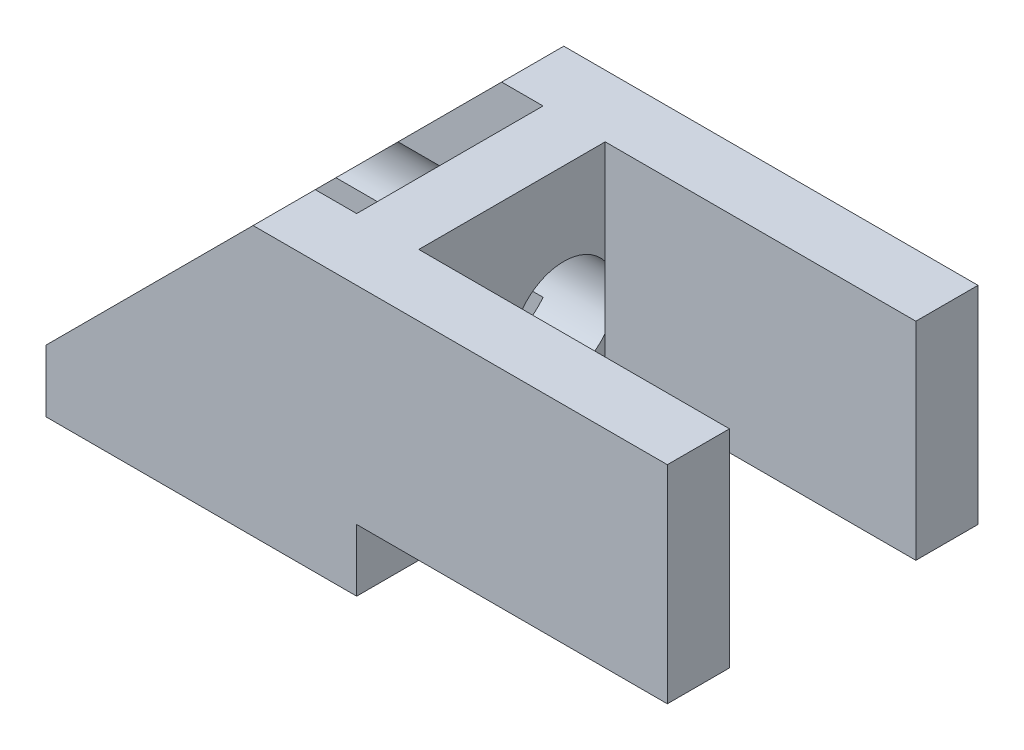
ISO-10303-21;
HEADER;
FILE_DESCRIPTION(('STEP AP214'),'2;1');
FILE_NAME('part.step','',(''),(''),'','','');
FILE_SCHEMA(('AUTOMOTIVE_DESIGN { 1 0 10303 214 1 1 1 1 }'));
ENDSEC;
DATA;
#1=APPLICATION_CONTEXT('core data for automotive mechanical design processes');
#2=APPLICATION_PROTOCOL_DEFINITION('international standard','automotive_design',2000,#1);
#3=PRODUCT_CONTEXT('',#1,'mechanical');
#4=PRODUCT('Part','Part','',(#3));
#5=PRODUCT_RELATED_PRODUCT_CATEGORY('part','',(#4));
#6=PRODUCT_DEFINITION_FORMATION('','',#4);
#7=PRODUCT_DEFINITION_CONTEXT('part definition',#1,'design');
#8=PRODUCT_DEFINITION('design','',#6,#7);
#9=PRODUCT_DEFINITION_SHAPE('','',#8);
#10=(LENGTH_UNIT() NAMED_UNIT(*) SI_UNIT(.MILLI.,.METRE.));
#11=(NAMED_UNIT(*) PLANE_ANGLE_UNIT() SI_UNIT($,.RADIAN.));
#12=(NAMED_UNIT(*) SI_UNIT($,.STERADIAN.) SOLID_ANGLE_UNIT());
#13=UNCERTAINTY_MEASURE_WITH_UNIT(LENGTH_MEASURE(1.E-05),#10,'distance_accuracy_value','');
#14=(GEOMETRIC_REPRESENTATION_CONTEXT(3) GLOBAL_UNCERTAINTY_ASSIGNED_CONTEXT((#13)) GLOBAL_UNIT_ASSIGNED_CONTEXT((#10,
#11,#12)) REPRESENTATION_CONTEXT('',''));
#15=CARTESIAN_POINT('',(0.,0.,0.));
#16=DIRECTION('',(0.,0.,1.));
#17=DIRECTION('',(1.,0.,0.));
#18=AXIS2_PLACEMENT_3D('',#15,#16,#17);
#19=CARTESIAN_POINT('',(0.,0.,-12.));
#20=DIRECTION('',(0.,0.,-1.));
#21=DIRECTION('',(1.,0.,0.));
#22=AXIS2_PLACEMENT_3D('',#19,#20,#21);
#23=PLANE('',#22);
#24=DIRECTION('',(-0.707106781186547,-0.707106781186548,0.));
#25=VECTOR('',#24,1.);
#26=CARTESIAN_POINT('',(0.,3.,-12.));
#27=LINE('',#26,#25);
#28=CARTESIAN_POINT('',(10.,13.,-12.));
#29=VERTEX_POINT('',#28);
#30=CARTESIAN_POINT('',(5.,8.,-12.));
#31=VERTEX_POINT('',#30);
#32=EDGE_CURVE('E170',#29,#31,#27,.T.);
#33=ORIENTED_EDGE('',*,*,#32,.T.);
#34=DIRECTION('',(1.,0.,0.));
#35=VECTOR('',#34,1.);
#36=CARTESIAN_POINT('',(-0.000999999999999265,8.,-12.));
#37=LINE('',#36,#35);
#38=CARTESIAN_POINT('',(12.,8.,-12.));
#39=VERTEX_POINT('',#38);
#40=EDGE_CURVE('E159',#39,#31,#37,.F.);
#41=ORIENTED_EDGE('',*,*,#40,.F.);
#42=DIRECTION('',(0.,1.,0.));
#43=VECTOR('',#42,1.);
#44=CARTESIAN_POINT('',(12.,13.,-12.));
#45=LINE('',#44,#43);
#46=CARTESIAN_POINT('',(12.,13.,-12.));
#47=VERTEX_POINT('',#46);
#48=EDGE_CURVE('E167',#39,#47,#45,.T.);
#49=ORIENTED_EDGE('',*,*,#48,.T.);
#50=DIRECTION('',(-1.,0.,0.));
#51=VECTOR('',#50,1.);
#52=CARTESIAN_POINT('',(10.,13.,-12.));
#53=LINE('',#52,#51);
#54=EDGE_CURVE('E202',#47,#29,#53,.T.);
#55=ORIENTED_EDGE('',*,*,#54,.T.);
#56=EDGE_LOOP('',(#33,#41,#49,#55));
#57=FACE_BOUND('',#56,.T.);
#58=ADVANCED_FACE('F33',(#57),#23,.F.);
#59=CARTESIAN_POINT('',(0.,3.,0.));
#60=DIRECTION('',(0.,-1.,0.));
#61=DIRECTION('',(0.,0.,-1.));
#62=AXIS2_PLACEMENT_3D('',#59,#60,#61);
#63=PLANE('',#62);
#64=DIRECTION('',(0.,0.,-1.));
#65=VECTOR('',#64,1.);
#66=CARTESIAN_POINT('',(12.,3.,-3.));
#67=LINE('',#66,#65);
#68=CARTESIAN_POINT('',(12.,3.,-3.));
#69=VERTEX_POINT('',#68);
#70=CARTESIAN_POINT('',(12.,3.,-12.));
#71=VERTEX_POINT('',#70);
#72=EDGE_CURVE('E178',#69,#71,#67,.T.);
#73=ORIENTED_EDGE('',*,*,#72,.T.);
#74=DIRECTION('',(1.,0.,0.));
#75=VECTOR('',#74,1.);
#76=CARTESIAN_POINT('',(30.,3.,-12.));
#77=LINE('',#76,#75);
#78=CARTESIAN_POINT('',(0.,3.,-12.));
#79=VERTEX_POINT('',#78);
#80=EDGE_CURVE('E196',#79,#71,#77,.T.);
#81=ORIENTED_EDGE('',*,*,#80,.F.);
#82=DIRECTION('',(0.,0.,1.));
#83=VECTOR('',#82,1.);
#84=CARTESIAN_POINT('',(0.,3.,0.));
#85=LINE('',#84,#83);
#86=CARTESIAN_POINT('',(0.,3.,-3.));
#87=VERTEX_POINT('',#86);
#88=EDGE_CURVE('E264',#79,#87,#85,.T.);
#89=ORIENTED_EDGE('',*,*,#88,.T.);
#90=DIRECTION('',(1.,0.,0.));
#91=VECTOR('',#90,1.);
#92=CARTESIAN_POINT('',(30.,3.,-3.));
#93=LINE('',#92,#91);
#94=EDGE_CURVE('E226',#87,#69,#93,.T.);
#95=ORIENTED_EDGE('',*,*,#94,.T.);
#96=EDGE_LOOP('',(#73,#81,#89,#95));
#97=FACE_BOUND('',#96,.T.);
#98=ADVANCED_FACE('F351',(#97),#63,.F.);
#99=CARTESIAN_POINT('',(0.,0.,-3.));
#100=DIRECTION('',(0.,0.,1.));
#101=DIRECTION('',(1.,0.,0.));
#102=AXIS2_PLACEMENT_3D('',#99,#100,#101);
#103=PLANE('',#102);
#104=DIRECTION('',(0.,-1.,0.));
#105=VECTOR('',#104,1.);
#106=CARTESIAN_POINT('',(12.,13.,-3.));
#107=LINE('',#106,#105);
#108=CARTESIAN_POINT('',(12.,13.,-3.));
#109=VERTEX_POINT('',#108);
#110=EDGE_CURVE('E181',#109,#69,#107,.T.);
#111=ORIENTED_EDGE('',*,*,#110,.T.);
#112=ORIENTED_EDGE('',*,*,#94,.F.);
#113=DIRECTION('',(-0.707106781186547,-0.707106781186548,0.));
#114=VECTOR('',#113,1.);
#115=CARTESIAN_POINT('',(0.,3.,-3.));
#116=LINE('',#115,#114);
#117=CARTESIAN_POINT('',(10.,13.,-3.));
#118=VERTEX_POINT('',#117);
#119=EDGE_CURVE('E237',#118,#87,#116,.T.);
#120=ORIENTED_EDGE('',*,*,#119,.F.);
#121=DIRECTION('',(-1.,0.,0.));
#122=VECTOR('',#121,1.);
#123=CARTESIAN_POINT('',(10.,13.,-3.));
#124=LINE('',#123,#122);
#125=EDGE_CURVE('E233',#109,#118,#124,.T.);
#126=ORIENTED_EDGE('',*,*,#125,.F.);
#127=EDGE_LOOP('',(#111,#112,#120,#126));
#128=FACE_BOUND('',#127,.T.);
#129=ADVANCED_FACE('F349',(#128),#103,.F.);
#130=CARTESIAN_POINT('',(12.,5.,-12.));
#131=VERTEX_POINT('',#130);
#132=EDGE_CURVE('E177',#71,#131,#45,.T.);
#133=ORIENTED_EDGE('',*,*,#132,.T.);
#134=DIRECTION('',(1.,0.,0.));
#135=VECTOR('',#134,1.);
#136=CARTESIAN_POINT('',(-0.000999999999999265,5.,-12.));
#137=LINE('',#136,#135);
#138=CARTESIAN_POINT('',(2.,5.,-12.));
#139=VERTEX_POINT('',#138);
#140=EDGE_CURVE('E55',#139,#131,#137,.T.);
#141=ORIENTED_EDGE('',*,*,#140,.F.);
#142=EDGE_CURVE('E199',#139,#79,#27,.T.);
#143=ORIENTED_EDGE('',*,*,#142,.T.);
#144=ORIENTED_EDGE('',*,*,#80,.T.);
#145=EDGE_LOOP('',(#133,#141,#143,#144));
#146=FACE_BOUND('',#145,.T.);
#147=ADVANCED_FACE('F354',(#146),#23,.F.);
#148=CARTESIAN_POINT('',(0.,3.,0.));
#149=DIRECTION('',(1.,0.,0.));
#150=DIRECTION('',(0.,0.,-1.));
#151=AXIS2_PLACEMENT_3D('',#148,#149,#150);
#152=PLANE('',#151);
#153=DIRECTION('',(0.,0.,1.));
#154=VECTOR('',#153,1.);
#155=CARTESIAN_POINT('',(0.,0.,0.));
#156=LINE('',#155,#154);
#157=CARTESIAN_POINT('',(0.,0.,-15.));
#158=VERTEX_POINT('',#157);
#159=CARTESIAN_POINT('',(0.,0.,0.));
#160=VERTEX_POINT('',#159);
#161=EDGE_CURVE('E253',#158,#160,#156,.T.);
#162=ORIENTED_EDGE('',*,*,#161,.T.);
#163=DIRECTION('',(0.,-1.,0.));
#164=VECTOR('',#163,1.);
#165=CARTESIAN_POINT('',(0.,3.,0.));
#166=LINE('',#165,#164);
#167=CARTESIAN_POINT('',(0.,3.,0.));
#168=VERTEX_POINT('',#167);
#169=EDGE_CURVE('E11',#168,#160,#166,.T.);
#170=ORIENTED_EDGE('',*,*,#169,.F.);
#171=DIRECTION('',(0.,0.,1.));
#172=VECTOR('',#171,1.);
#173=CARTESIAN_POINT('',(0.,3.,-3.));
#174=LINE('',#173,#172);
#175=EDGE_CURVE('E251',#87,#168,#174,.T.);
#176=ORIENTED_EDGE('',*,*,#175,.F.);
#177=ORIENTED_EDGE('',*,*,#88,.F.);
#178=CARTESIAN_POINT('',(0.,3.,-15.));
#179=VERTEX_POINT('',#178);
#180=EDGE_CURVE('E260',#179,#79,#85,.T.);
#181=ORIENTED_EDGE('',*,*,#180,.F.);
#182=DIRECTION('',(0.,-1.,0.));
#183=VECTOR('',#182,1.);
#184=CARTESIAN_POINT('',(0.,3.,-15.));
#185=LINE('',#184,#183);
#186=EDGE_CURVE('E268',#179,#158,#185,.T.);
#187=ORIENTED_EDGE('',*,*,#186,.T.);
#188=EDGE_LOOP('',(#162,#170,#176,#177,#181,#187));
#189=FACE_BOUND('',#188,.T.);
#190=ADVANCED_FACE('F35',(#189),#152,.F.);
#191=CARTESIAN_POINT('',(0.,3.,0.));
#192=DIRECTION('',(0.,0.,-1.));
#193=DIRECTION('',(-1.,0.,0.));
#194=AXIS2_PLACEMENT_3D('',#191,#192,#193);
#195=PLANE('',#194);
#196=DIRECTION('',(0.,-1.,0.));
#197=VECTOR('',#196,1.);
#198=CARTESIAN_POINT('',(15.,3.,0.));
#199=LINE('',#198,#197);
#200=CARTESIAN_POINT('',(15.,3.,0.));
#201=VERTEX_POINT('',#200);
#202=CARTESIAN_POINT('',(15.,0.,0.));
#203=VERTEX_POINT('',#202);
#204=EDGE_CURVE('E41',#201,#203,#199,.T.);
#205=ORIENTED_EDGE('',*,*,#204,.F.);
#206=DIRECTION('',(1.,0.,0.));
#207=VECTOR('',#206,1.);
#208=CARTESIAN_POINT('',(30.,3.,0.));
#209=LINE('',#208,#207);
#210=CARTESIAN_POINT('',(30.,3.,0.));
#211=VERTEX_POINT('',#210);
#212=EDGE_CURVE('E220',#201,#211,#209,.T.);
#213=ORIENTED_EDGE('',*,*,#212,.T.);
#214=DIRECTION('',(0.,1.,0.));
#215=VECTOR('',#214,1.);
#216=CARTESIAN_POINT('',(30.,13.,0.));
#217=LINE('',#216,#215);
#218=CARTESIAN_POINT('',(30.,13.,0.));
#219=VERTEX_POINT('',#218);
#220=EDGE_CURVE('E242',#211,#219,#217,.T.);
#221=ORIENTED_EDGE('',*,*,#220,.T.);
#222=DIRECTION('',(-1.,0.,0.));
#223=VECTOR('',#222,1.);
#224=CARTESIAN_POINT('',(10.,13.,0.));
#225=LINE('',#224,#223);
#226=CARTESIAN_POINT('',(10.,13.,0.));
#227=VERTEX_POINT('',#226);
#228=EDGE_CURVE('E245',#219,#227,#225,.T.);
#229=ORIENTED_EDGE('',*,*,#228,.T.);
#230=DIRECTION('',(-0.707106781186547,-0.707106781186548,0.));
#231=VECTOR('',#230,1.);
#232=CARTESIAN_POINT('',(0.,3.,0.));
#233=LINE('',#232,#231);
#234=EDGE_CURVE('E248',#227,#168,#233,.T.);
#235=ORIENTED_EDGE('',*,*,#234,.T.);
#236=ORIENTED_EDGE('',*,*,#169,.T.);
#237=DIRECTION('',(1.,0.,0.));
#238=VECTOR('',#237,1.);
#239=CARTESIAN_POINT('',(0.,0.,0.));
#240=LINE('',#239,#238);
#241=EDGE_CURVE('E271',#160,#203,#240,.T.);
#242=ORIENTED_EDGE('',*,*,#241,.T.);
#243=EDGE_LOOP('',(#205,#213,#221,#229,#235,#236,#242));
#244=FACE_BOUND('',#243,.T.);
#245=ADVANCED_FACE('F339',(#244),#195,.F.);
#246=CARTESIAN_POINT('',(15.,3.,0.));
#247=DIRECTION('',(-1.,0.,0.));
#248=DIRECTION('',(0.,0.,1.));
#249=AXIS2_PLACEMENT_3D('',#246,#247,#248);
#250=PLANE('',#249);
#251=DIRECTION('',(0.,1.,0.));
#252=VECTOR('',#251,1.);
#253=CARTESIAN_POINT('',(15.,13.,-12.));
#254=LINE('',#253,#252);
#255=CARTESIAN_POINT('',(15.,3.,-12.));
#256=VERTEX_POINT('',#255);
#257=CARTESIAN_POINT('',(15.,5.,-12.));
#258=VERTEX_POINT('',#257);
#259=EDGE_CURVE('E190',#256,#258,#254,.T.);
#260=ORIENTED_EDGE('',*,*,#259,.T.);
#261=CARTESIAN_POINT('',(15.,6.5,-10.));
#262=DIRECTION('',(1.,0.,0.));
#263=DIRECTION('',(0.,0.,-1.));
#264=AXIS2_PLACEMENT_3D('',#261,#262,#263);
#265=CIRCLE('',#264,2.5);
#266=CARTESIAN_POINT('',(15.,8.,-12.));
#267=VERTEX_POINT('',#266);
#268=EDGE_CURVE('E47',#267,#258,#265,.T.);
#269=ORIENTED_EDGE('',*,*,#268,.F.);
#270=CARTESIAN_POINT('',(15.,13.,-12.));
#271=VERTEX_POINT('',#270);
#272=EDGE_CURVE('E189',#267,#271,#254,.T.);
#273=ORIENTED_EDGE('',*,*,#272,.T.);
#274=DIRECTION('',(0.,0.,1.));
#275=VECTOR('',#274,1.);
#276=CARTESIAN_POINT('',(15.,13.,-3.));
#277=LINE('',#276,#275);
#278=CARTESIAN_POINT('',(15.,13.,-3.));
#279=VERTEX_POINT('',#278);
#280=EDGE_CURVE('E193',#271,#279,#277,.T.);
#281=ORIENTED_EDGE('',*,*,#280,.T.);
#282=DIRECTION('',(0.,-1.,0.));
#283=VECTOR('',#282,1.);
#284=CARTESIAN_POINT('',(15.,13.,-3.));
#285=LINE('',#284,#283);
#286=CARTESIAN_POINT('',(15.,3.,-3.));
#287=VERTEX_POINT('',#286);
#288=EDGE_CURVE('E187',#279,#287,#285,.T.);
#289=ORIENTED_EDGE('',*,*,#288,.T.);
#290=DIRECTION('',(0.,0.,-1.));
#291=VECTOR('',#290,1.);
#292=CARTESIAN_POINT('',(15.,3.,0.));
#293=LINE('',#292,#291);
#294=EDGE_CURVE('E265',#201,#287,#293,.T.);
#295=ORIENTED_EDGE('',*,*,#294,.F.);
#296=ORIENTED_EDGE('',*,*,#204,.T.);
#297=DIRECTION('',(0.,0.,-1.));
#298=VECTOR('',#297,1.);
#299=CARTESIAN_POINT('',(15.,0.,0.));
#300=LINE('',#299,#298);
#301=CARTESIAN_POINT('',(15.,0.,-15.));
#302=VERTEX_POINT('',#301);
#303=EDGE_CURVE('E273',#203,#302,#300,.T.);
#304=ORIENTED_EDGE('',*,*,#303,.T.);
#305=DIRECTION('',(0.,-1.,0.));
#306=VECTOR('',#305,1.);
#307=CARTESIAN_POINT('',(15.,3.,-15.));
#308=LINE('',#307,#306);
#309=CARTESIAN_POINT('',(15.,3.,-15.));
#310=VERTEX_POINT('',#309);
#311=EDGE_CURVE('E279',#310,#302,#308,.T.);
#312=ORIENTED_EDGE('',*,*,#311,.F.);
#313=EDGE_CURVE('E263',#256,#310,#293,.T.);
#314=ORIENTED_EDGE('',*,*,#313,.F.);
#315=EDGE_LOOP('',(#260,#269,#273,#281,#289,#295,#296,#304,#312,#314));
#316=FACE_BOUND('',#315,.T.);
#317=ADVANCED_FACE('F286',(#316),#250,.F.);
#318=CARTESIAN_POINT('',(0.,3.,-15.));
#319=DIRECTION('',(0.,0.,1.));
#320=DIRECTION('',(1.,0.,0.));
#321=AXIS2_PLACEMENT_3D('',#318,#319,#320);
#322=PLANE('',#321);
#323=DIRECTION('',(-1.,0.,0.));
#324=VECTOR('',#323,1.);
#325=CARTESIAN_POINT('',(0.,0.,-15.));
#326=LINE('',#325,#324);
#327=EDGE_CURVE('E275',#302,#158,#326,.T.);
#328=ORIENTED_EDGE('',*,*,#327,.T.);
#329=ORIENTED_EDGE('',*,*,#186,.F.);
#330=DIRECTION('',(-0.707106781186547,-0.707106781186548,0.));
#331=VECTOR('',#330,1.);
#332=CARTESIAN_POINT('',(0.,3.,-15.));
#333=LINE('',#332,#331);
#334=CARTESIAN_POINT('',(10.,13.,-15.));
#335=VERTEX_POINT('',#334);
#336=EDGE_CURVE('E210',#335,#179,#333,.T.);
#337=ORIENTED_EDGE('',*,*,#336,.F.);
#338=DIRECTION('',(-1.,0.,0.));
#339=VECTOR('',#338,1.);
#340=CARTESIAN_POINT('',(10.,13.,-15.));
#341=LINE('',#340,#339);
#342=CARTESIAN_POINT('',(30.,13.,-15.));
#343=VERTEX_POINT('',#342);
#344=EDGE_CURVE('E213',#343,#335,#341,.T.);
#345=ORIENTED_EDGE('',*,*,#344,.F.);
#346=DIRECTION('',(0.,1.,0.));
#347=VECTOR('',#346,1.);
#348=CARTESIAN_POINT('',(30.,13.,-15.));
#349=LINE('',#348,#347);
#350=CARTESIAN_POINT('',(30.,3.,-15.));
#351=VERTEX_POINT('',#350);
#352=EDGE_CURVE('E215',#351,#343,#349,.T.);
#353=ORIENTED_EDGE('',*,*,#352,.F.);
#354=DIRECTION('',(1.,0.,0.));
#355=VECTOR('',#354,1.);
#356=CARTESIAN_POINT('',(30.,3.,-15.));
#357=LINE('',#356,#355);
#358=EDGE_CURVE('E186',#310,#351,#357,.T.);
#359=ORIENTED_EDGE('',*,*,#358,.F.);
#360=ORIENTED_EDGE('',*,*,#311,.T.);
#361=EDGE_LOOP('',(#328,#329,#337,#345,#353,#359,#360));
#362=FACE_BOUND('',#361,.T.);
#363=ADVANCED_FACE('F294',(#362),#322,.F.);
#364=CARTESIAN_POINT('',(0.,0.,0.));
#365=DIRECTION('',(0.,-1.,0.));
#366=DIRECTION('',(0.,0.,-1.));
#367=AXIS2_PLACEMENT_3D('',#364,#365,#366);
#368=PLANE('',#367);
#369=ORIENTED_EDGE('',*,*,#161,.F.);
#370=ORIENTED_EDGE('',*,*,#327,.F.);
#371=ORIENTED_EDGE('',*,*,#303,.F.);
#372=ORIENTED_EDGE('',*,*,#241,.F.);
#373=EDGE_LOOP('',(#369,#370,#371,#372));
#374=FACE_BOUND('',#373,.T.);
#375=ADVANCED_FACE('F291',(#374),#368,.T.);
#376=CARTESIAN_POINT('',(30.,3.,-3.));
#377=DIRECTION('',(0.,-1.,0.));
#378=DIRECTION('',(0.,0.,-1.));
#379=AXIS2_PLACEMENT_3D('',#376,#377,#378);
#380=PLANE('',#379);
#381=ORIENTED_EDGE('',*,*,#212,.F.);
#382=ORIENTED_EDGE('',*,*,#294,.T.);
#383=CARTESIAN_POINT('',(30.,3.,-3.));
#384=VERTEX_POINT('',#383);
#385=EDGE_CURVE('E230',#287,#384,#93,.T.);
#386=ORIENTED_EDGE('',*,*,#385,.T.);
#387=DIRECTION('',(0.,0.,1.));
#388=VECTOR('',#387,1.);
#389=CARTESIAN_POINT('',(30.,3.,-3.));
#390=LINE('',#389,#388);
#391=EDGE_CURVE('E240',#384,#211,#390,.T.);
#392=ORIENTED_EDGE('',*,*,#391,.T.);
#393=EDGE_LOOP('',(#381,#382,#386,#392));
#394=FACE_BOUND('',#393,.T.);
#395=ADVANCED_FACE('F338',(#394),#380,.T.);
#396=CARTESIAN_POINT('',(0.,3.,-3.));
#397=DIRECTION('',(-0.707106781186548,0.707106781186547,0.));
#398=DIRECTION('',(-0.707106781186547,-0.707106781186548,0.));
#399=AXIS2_PLACEMENT_3D('',#396,#397,#398);
#400=PLANE('',#399);
#401=ORIENTED_EDGE('',*,*,#234,.F.);
#402=DIRECTION('',(0.,0.,1.));
#403=VECTOR('',#402,1.);
#404=CARTESIAN_POINT('',(10.,13.,-3.));
#405=LINE('',#404,#403);
#406=EDGE_CURVE('E254',#118,#227,#405,.T.);
#407=ORIENTED_EDGE('',*,*,#406,.F.);
#408=ORIENTED_EDGE('',*,*,#119,.T.);
#409=ORIENTED_EDGE('',*,*,#175,.T.);
#410=EDGE_LOOP('',(#401,#407,#408,#409));
#411=FACE_BOUND('',#410,.T.);
#412=ADVANCED_FACE('F343',(#411),#400,.T.);
#413=CARTESIAN_POINT('',(10.,13.,-3.));
#414=DIRECTION('',(0.,1.,0.));
#415=DIRECTION('',(0.,0.,1.));
#416=AXIS2_PLACEMENT_3D('',#413,#414,#415);
#417=PLANE('',#416);
#418=ORIENTED_EDGE('',*,*,#228,.F.);
#419=DIRECTION('',(0.,0.,1.));
#420=VECTOR('',#419,1.);
#421=CARTESIAN_POINT('',(30.,13.,-3.));
#422=LINE('',#421,#420);
#423=CARTESIAN_POINT('',(30.,13.,-3.));
#424=VERTEX_POINT('',#423);
#425=EDGE_CURVE('E256',#424,#219,#422,.T.);
#426=ORIENTED_EDGE('',*,*,#425,.F.);
#427=EDGE_CURVE('E234',#424,#279,#124,.T.);
#428=ORIENTED_EDGE('',*,*,#427,.T.);
#429=ORIENTED_EDGE('',*,*,#280,.F.);
#430=CARTESIAN_POINT('',(30.,13.,-12.));
#431=VERTEX_POINT('',#430);
#432=EDGE_CURVE('E203',#431,#271,#53,.T.);
#433=ORIENTED_EDGE('',*,*,#432,.F.);
#434=DIRECTION('',(0.,0.,-1.));
#435=VECTOR('',#434,1.);
#436=CARTESIAN_POINT('',(30.,13.,-12.));
#437=LINE('',#436,#435);
#438=EDGE_CURVE('E221',#431,#343,#437,.T.);
#439=ORIENTED_EDGE('',*,*,#438,.T.);
#440=ORIENTED_EDGE('',*,*,#344,.T.);
#441=DIRECTION('',(0.,0.,-1.));
#442=VECTOR('',#441,1.);
#443=CARTESIAN_POINT('',(10.,13.,-12.));
#444=LINE('',#443,#442);
#445=EDGE_CURVE('E208',#29,#335,#444,.T.);
#446=ORIENTED_EDGE('',*,*,#445,.F.);
#447=ORIENTED_EDGE('',*,*,#54,.F.);
#448=DIRECTION('',(0.,0.,1.));
#449=VECTOR('',#448,1.);
#450=CARTESIAN_POINT('',(12.,13.,-3.));
#451=LINE('',#450,#449);
#452=EDGE_CURVE('E175',#47,#109,#451,.T.);
#453=ORIENTED_EDGE('',*,*,#452,.T.);
#454=ORIENTED_EDGE('',*,*,#125,.T.);
#455=ORIENTED_EDGE('',*,*,#406,.T.);
#456=EDGE_LOOP('',(#418,#426,#428,#429,#433,#439,#440,#446,#447,#453,#454,#455));
#457=FACE_BOUND('',#456,.T.);
#458=ADVANCED_FACE('F309',(#457),#417,.T.);
#459=CARTESIAN_POINT('',(30.,13.,-3.));
#460=DIRECTION('',(1.,0.,0.));
#461=DIRECTION('',(0.,0.,-1.));
#462=AXIS2_PLACEMENT_3D('',#459,#460,#461);
#463=PLANE('',#462);
#464=ORIENTED_EDGE('',*,*,#220,.F.);
#465=ORIENTED_EDGE('',*,*,#391,.F.);
#466=DIRECTION('',(0.,1.,0.));
#467=VECTOR('',#466,1.);
#468=CARTESIAN_POINT('',(30.,13.,-3.));
#469=LINE('',#468,#467);
#470=EDGE_CURVE('E229',#384,#424,#469,.T.);
#471=ORIENTED_EDGE('',*,*,#470,.T.);
#472=ORIENTED_EDGE('',*,*,#425,.T.);
#473=EDGE_LOOP('',(#464,#465,#471,#472));
#474=FACE_BOUND('',#473,.T.);
#475=ADVANCED_FACE('F336',(#474),#463,.T.);
#476=ORIENTED_EDGE('',*,*,#385,.F.);
#477=ORIENTED_EDGE('',*,*,#288,.F.);
#478=ORIENTED_EDGE('',*,*,#427,.F.);
#479=ORIENTED_EDGE('',*,*,#470,.F.);
#480=EDGE_LOOP('',(#476,#477,#478,#479));
#481=FACE_BOUND('',#480,.T.);
#482=ADVANCED_FACE('F332',(#481),#103,.F.);
#483=CARTESIAN_POINT('',(30.,3.,-12.));
#484=DIRECTION('',(0.,1.,0.));
#485=DIRECTION('',(0.,0.,1.));
#486=AXIS2_PLACEMENT_3D('',#483,#484,#485);
#487=PLANE('',#486);
#488=CARTESIAN_POINT('',(30.,3.,-12.));
#489=VERTEX_POINT('',#488);
#490=EDGE_CURVE('E200',#256,#489,#77,.T.);
#491=ORIENTED_EDGE('',*,*,#490,.F.);
#492=ORIENTED_EDGE('',*,*,#313,.T.);
#493=ORIENTED_EDGE('',*,*,#358,.T.);
#494=DIRECTION('',(0.,0.,-1.));
#495=VECTOR('',#494,1.);
#496=CARTESIAN_POINT('',(30.,3.,-12.));
#497=LINE('',#496,#495);
#498=EDGE_CURVE('E217',#489,#351,#497,.T.);
#499=ORIENTED_EDGE('',*,*,#498,.F.);
#500=EDGE_LOOP('',(#491,#492,#493,#499));
#501=FACE_BOUND('',#500,.T.);
#502=ADVANCED_FACE('F319',(#501),#487,.F.);
#503=CARTESIAN_POINT('',(30.,13.,-12.));
#504=DIRECTION('',(-1.,0.,0.));
#505=DIRECTION('',(0.,0.,1.));
#506=AXIS2_PLACEMENT_3D('',#503,#504,#505);
#507=PLANE('',#506);
#508=ORIENTED_EDGE('',*,*,#352,.T.);
#509=ORIENTED_EDGE('',*,*,#438,.F.);
#510=DIRECTION('',(0.,1.,0.));
#511=VECTOR('',#510,1.);
#512=CARTESIAN_POINT('',(30.,13.,-12.));
#513=LINE('',#512,#511);
#514=EDGE_CURVE('E206',#489,#431,#513,.T.);
#515=ORIENTED_EDGE('',*,*,#514,.F.);
#516=ORIENTED_EDGE('',*,*,#498,.T.);
#517=EDGE_LOOP('',(#508,#509,#515,#516));
#518=FACE_BOUND('',#517,.T.);
#519=ADVANCED_FACE('F315',(#518),#507,.F.);
#520=CARTESIAN_POINT('',(0.,3.,-12.));
#521=DIRECTION('',(0.707106781186548,-0.707106781186547,0.));
#522=DIRECTION('',(0.707106781186547,0.707106781186548,0.));
#523=AXIS2_PLACEMENT_3D('',#520,#521,#522);
#524=PLANE('',#523);
#525=ORIENTED_EDGE('',*,*,#142,.F.);
#526=CARTESIAN_POINT('',(3.5,6.5,-10.));
#527=DIRECTION('',(0.707106781186548,-0.707106781186547,0.));
#528=DIRECTION('',(0.707106781186547,0.707106781186548,0.));
#529=AXIS2_PLACEMENT_3D('',#526,#527,#528);
#530=ELLIPSE('',#529,3.53553390593274,2.5);
#531=EDGE_CURVE('E171',#31,#139,#530,.F.);
#532=ORIENTED_EDGE('',*,*,#531,.F.);
#533=ORIENTED_EDGE('',*,*,#32,.F.);
#534=ORIENTED_EDGE('',*,*,#445,.T.);
#535=ORIENTED_EDGE('',*,*,#336,.T.);
#536=ORIENTED_EDGE('',*,*,#180,.T.);
#537=EDGE_LOOP('',(#525,#532,#533,#534,#535,#536));
#538=FACE_BOUND('',#537,.T.);
#539=ADVANCED_FACE('F303',(#538),#524,.F.);
#540=ORIENTED_EDGE('',*,*,#432,.T.);
#541=ORIENTED_EDGE('',*,*,#272,.F.);
#542=EDGE_CURVE('E194',#258,#267,#254,.T.);
#543=ORIENTED_EDGE('',*,*,#542,.F.);
#544=ORIENTED_EDGE('',*,*,#259,.F.);
#545=ORIENTED_EDGE('',*,*,#490,.T.);
#546=ORIENTED_EDGE('',*,*,#514,.T.);
#547=EDGE_LOOP('',(#540,#541,#543,#544,#545,#546));
#548=FACE_BOUND('',#547,.T.);
#549=ADVANCED_FACE('F325',(#548),#23,.F.);
#550=CARTESIAN_POINT('',(12.,0.,0.));
#551=DIRECTION('',(1.,0.,0.));
#552=DIRECTION('',(0.,0.,-1.));
#553=AXIS2_PLACEMENT_3D('',#550,#551,#552);
#554=PLANE('',#553);
#555=ORIENTED_EDGE('',*,*,#48,.F.);
#556=CARTESIAN_POINT('',(12.,6.5,-10.));
#557=DIRECTION('',(1.,0.,0.));
#558=DIRECTION('',(0.,0.,-1.));
#559=AXIS2_PLACEMENT_3D('',#556,#557,#558);
#560=CIRCLE('',#559,2.5);
#561=EDGE_CURVE('E156',#131,#39,#560,.F.);
#562=ORIENTED_EDGE('',*,*,#561,.F.);
#563=ORIENTED_EDGE('',*,*,#132,.F.);
#564=ORIENTED_EDGE('',*,*,#72,.F.);
#565=ORIENTED_EDGE('',*,*,#110,.F.);
#566=ORIENTED_EDGE('',*,*,#452,.F.);
#567=EDGE_LOOP('',(#555,#562,#563,#564,#565,#566));
#568=FACE_BOUND('',#567,.T.);
#569=ADVANCED_FACE('F173',(#568),#554,.F.);
#570=CARTESIAN_POINT('',(15.,6.5,-10.));
#571=DIRECTION('',(1.,0.,0.));
#572=DIRECTION('',(0.,0.,-1.));
#573=AXIS2_PLACEMENT_3D('',#570,#571,#572);
#574=PLANE('',#573);
#575=EDGE_CURVE('E358',#258,#267,#265,.T.);
#576=ORIENTED_EDGE('',*,*,#575,.F.);
#577=ORIENTED_EDGE('',*,*,#542,.T.);
#578=EDGE_LOOP('',(#576,#577));
#579=FACE_BOUND('',#578,.T.);
#580=ADVANCED_FACE('F359',(#579),#574,.F.);
#581=CARTESIAN_POINT('',(-0.000999999999999265,6.5,-10.));
#582=DIRECTION('',(1.,0.,0.));
#583=DIRECTION('',(0.,0.,-1.));
#584=AXIS2_PLACEMENT_3D('',#581,#582,#583);
#585=CYLINDRICAL_SURFACE('',#584,2.5);
#586=ORIENTED_EDGE('',*,*,#268,.T.);
#587=ORIENTED_EDGE('',*,*,#575,.T.);
#588=EDGE_LOOP('',(#586,#587));
#589=FACE_BOUND('',#588,.T.);
#590=ORIENTED_EDGE('',*,*,#531,.T.);
#591=ORIENTED_EDGE('',*,*,#140,.T.);
#592=ORIENTED_EDGE('',*,*,#561,.T.);
#593=ORIENTED_EDGE('',*,*,#40,.T.);
#594=EDGE_LOOP('',(#590,#591,#592,#593));
#595=FACE_BOUND('',#594,.T.);
#596=ADVANCED_FACE('F158',(#589,#595),#585,.F.);
#597=CLOSED_SHELL('',(#58,#98,#129,#147,#190,#245,#317,#363,#375,#395,#412,#458,#475,#482,#502,
#519,#539,#549,#569,#580,#596));
#598=MANIFOLD_SOLID_BREP('B2',#597);
#599=ADVANCED_BREP_SHAPE_REPRESENTATION('',(#18,#598),#14);
#600=SHAPE_DEFINITION_REPRESENTATION(#9,#599);
ENDSEC;
END-ISO-10303-21;
